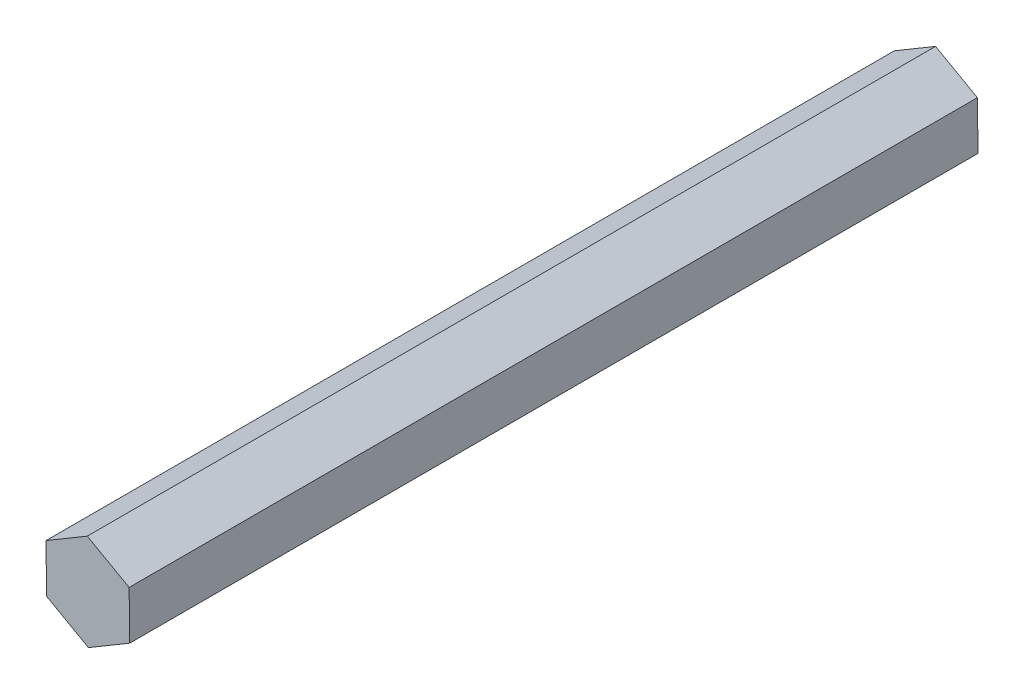
ISO-10303-21;
HEADER;
FILE_DESCRIPTION(('STEP AP214'),'2;1');
FILE_NAME('part.step','',(''),(''),'','','');
FILE_SCHEMA(('AUTOMOTIVE_DESIGN { 1 0 10303 214 1 1 1 1 }'));
ENDSEC;
DATA;
#1=APPLICATION_CONTEXT('core data for automotive mechanical design processes');
#2=APPLICATION_PROTOCOL_DEFINITION('international standard','automotive_design',2000,#1);
#3=PRODUCT_CONTEXT('',#1,'mechanical');
#4=PRODUCT('Part','Part','',(#3));
#5=PRODUCT_RELATED_PRODUCT_CATEGORY('part','',(#4));
#6=PRODUCT_DEFINITION_FORMATION('','',#4);
#7=PRODUCT_DEFINITION_CONTEXT('part definition',#1,'design');
#8=PRODUCT_DEFINITION('design','',#6,#7);
#9=PRODUCT_DEFINITION_SHAPE('','',#8);
#10=(LENGTH_UNIT() NAMED_UNIT(*) SI_UNIT(.MILLI.,.METRE.));
#11=(NAMED_UNIT(*) PLANE_ANGLE_UNIT() SI_UNIT($,.RADIAN.));
#12=(NAMED_UNIT(*) SI_UNIT($,.STERADIAN.) SOLID_ANGLE_UNIT());
#13=UNCERTAINTY_MEASURE_WITH_UNIT(LENGTH_MEASURE(1.E-05),#10,'distance_accuracy_value','');
#14=(GEOMETRIC_REPRESENTATION_CONTEXT(3) GLOBAL_UNCERTAINTY_ASSIGNED_CONTEXT((#13)) GLOBAL_UNIT_ASSIGNED_CONTEXT((#10,
#11,#12)) REPRESENTATION_CONTEXT('',''));
#15=CARTESIAN_POINT('',(0.,0.,0.));
#16=DIRECTION('',(0.,0.,1.));
#17=DIRECTION('',(1.,0.,0.));
#18=AXIS2_PLACEMENT_3D('',#15,#16,#17);
#19=CARTESIAN_POINT('',(1.23330691036255,-0.69266687389056,25.));
#20=DIRECTION('',(-0.999929581507346,-0.0118672670208256,0.));
#21=DIRECTION('',(0.0118672670208256,-0.999929581507346,0.));
#22=AXIS2_PLACEMENT_3D('',#19,#20,#21);
#23=PLANE('',#22);
#24=DIRECTION('',(-0.0118672670208256,0.999929581507346,0.));
#25=VECTOR('',#24,1.);
#26=CARTESIAN_POINT('',(1.23330691036255,-0.69266687389056,0.));
#27=LINE('',#26,#25);
#28=CARTESIAN_POINT('',(1.23330691036255,-0.69266687389056,0.));
#29=VERTEX_POINT('',#28);
#30=CARTESIAN_POINT('',(1.21652056433045,0.721741678091583,0.));
#31=VERTEX_POINT('',#30);
#32=EDGE_CURVE('E128',#29,#31,#27,.T.);
#33=ORIENTED_EDGE('',*,*,#32,.T.);
#34=DIRECTION('',(0.,0.,-1.));
#35=VECTOR('',#34,1.);
#36=CARTESIAN_POINT('',(1.21652056433045,0.721741678091583,25.));
#37=LINE('',#36,#35);
#38=CARTESIAN_POINT('',(1.21652056433045,0.721741678091583,25.));
#39=VERTEX_POINT('',#38);
#40=EDGE_CURVE('E11',#39,#31,#37,.T.);
#41=ORIENTED_EDGE('',*,*,#40,.F.);
#42=DIRECTION('',(-0.0118672670208256,0.999929581507346,0.));
#43=VECTOR('',#42,1.);
#44=CARTESIAN_POINT('',(1.23330691036255,-0.69266687389056,25.));
#45=LINE('',#44,#43);
#46=CARTESIAN_POINT('',(1.23330691036255,-0.69266687389056,25.));
#47=VERTEX_POINT('',#46);
#48=EDGE_CURVE('E144',#47,#39,#45,.T.);
#49=ORIENTED_EDGE('',*,*,#48,.F.);
#50=DIRECTION('',(0.,0.,-1.));
#51=VECTOR('',#50,1.);
#52=CARTESIAN_POINT('',(1.23330691036255,-0.69266687389056,25.));
#53=LINE('',#52,#51);
#54=EDGE_CURVE('E124',#47,#29,#53,.T.);
#55=ORIENTED_EDGE('',*,*,#54,.T.);
#56=EDGE_LOOP('',(#33,#41,#49,#55));
#57=FACE_BOUND('',#56,.T.);
#58=ADVANCED_FACE('F39',(#57),#23,.F.);
#59=CARTESIAN_POINT('',(1.21652056433045,0.721741678091583,25.));
#60=DIRECTION('',(-0.489687436040145,-0.871898053091317,0.));
#61=DIRECTION('',(0.871898053091317,-0.489687436040145,0.));
#62=AXIS2_PLACEMENT_3D('',#59,#60,#61);
#63=PLANE('',#62);
#64=DIRECTION('',(-0.871898053091317,0.489687436040145,0.));
#65=VECTOR('',#64,1.);
#66=CARTESIAN_POINT('',(1.21652056433045,0.721741678091583,0.));
#67=LINE('',#66,#65);
#68=CARTESIAN_POINT('',(-0.0167863460320959,1.41440855198214,0.));
#69=VERTEX_POINT('',#68);
#70=EDGE_CURVE('E132',#31,#69,#67,.T.);
#71=ORIENTED_EDGE('',*,*,#70,.T.);
#72=DIRECTION('',(0.,0.,-1.));
#73=VECTOR('',#72,1.);
#74=CARTESIAN_POINT('',(-0.0167863460320959,1.41440855198214,25.));
#75=LINE('',#74,#73);
#76=CARTESIAN_POINT('',(-0.0167863460320959,1.41440855198214,25.));
#77=VERTEX_POINT('',#76);
#78=EDGE_CURVE('E48',#77,#69,#75,.T.);
#79=ORIENTED_EDGE('',*,*,#78,.F.);
#80=DIRECTION('',(-0.871898053091317,0.489687436040145,0.));
#81=VECTOR('',#80,1.);
#82=CARTESIAN_POINT('',(1.21652056433045,0.721741678091583,25.));
#83=LINE('',#82,#81);
#84=EDGE_CURVE('E93',#39,#77,#83,.T.);
#85=ORIENTED_EDGE('',*,*,#84,.F.);
#86=ORIENTED_EDGE('',*,*,#40,.T.);
#87=EDGE_LOOP('',(#71,#79,#85,#86));
#88=FACE_BOUND('',#87,.T.);
#89=ADVANCED_FACE('F172',(#88),#63,.F.);
#90=CARTESIAN_POINT('',(-0.0167863460320959,1.41440855198214,25.));
#91=DIRECTION('',(0.510242145467202,-0.860030786070491,0.));
#92=DIRECTION('',(0.860030786070491,0.510242145467202,0.));
#93=AXIS2_PLACEMENT_3D('',#90,#91,#92);
#94=PLANE('',#93);
#95=DIRECTION('',(-0.860030786070491,-0.510242145467202,0.));
#96=VECTOR('',#95,1.);
#97=CARTESIAN_POINT('',(-0.0167863460320959,1.41440855198214,0.));
#98=LINE('',#97,#96);
#99=CARTESIAN_POINT('',(-1.23330691036255,0.69266687389056,0.));
#100=VERTEX_POINT('',#99);
#101=EDGE_CURVE('E135',#69,#100,#98,.T.);
#102=ORIENTED_EDGE('',*,*,#101,.T.);
#103=DIRECTION('',(0.,0.,-1.));
#104=VECTOR('',#103,1.);
#105=CARTESIAN_POINT('',(-1.23330691036255,0.69266687389056,25.));
#106=LINE('',#105,#104);
#107=CARTESIAN_POINT('',(-1.23330691036255,0.69266687389056,25.));
#108=VERTEX_POINT('',#107);
#109=EDGE_CURVE('E117',#108,#100,#106,.T.);
#110=ORIENTED_EDGE('',*,*,#109,.F.);
#111=DIRECTION('',(-0.860030786070491,-0.510242145467202,0.));
#112=VECTOR('',#111,1.);
#113=CARTESIAN_POINT('',(-0.0167863460320959,1.41440855198214,25.));
#114=LINE('',#113,#112);
#115=EDGE_CURVE('E106',#77,#108,#114,.T.);
#116=ORIENTED_EDGE('',*,*,#115,.F.);
#117=ORIENTED_EDGE('',*,*,#78,.T.);
#118=EDGE_LOOP('',(#102,#110,#116,#117));
#119=FACE_BOUND('',#118,.T.);
#120=ADVANCED_FACE('F154',(#119),#94,.F.);
#121=CARTESIAN_POINT('',(-1.23330691036255,0.69266687389056,25.));
#122=DIRECTION('',(0.999929581507346,0.0118672670208256,0.));
#123=DIRECTION('',(-0.0118672670208256,0.999929581507346,0.));
#124=AXIS2_PLACEMENT_3D('',#121,#122,#123);
#125=PLANE('',#124);
#126=DIRECTION('',(0.0118672670208256,-0.999929581507346,0.));
#127=VECTOR('',#126,1.);
#128=CARTESIAN_POINT('',(-1.23330691036255,0.69266687389056,0.));
#129=LINE('',#128,#127);
#130=CARTESIAN_POINT('',(-1.21652056433045,-0.721741678091584,0.));
#131=VERTEX_POINT('',#130);
#132=EDGE_CURVE('E115',#100,#131,#129,.T.);
#133=ORIENTED_EDGE('',*,*,#132,.T.);
#134=DIRECTION('',(0.,0.,-1.));
#135=VECTOR('',#134,1.);
#136=CARTESIAN_POINT('',(-1.21652056433045,-0.721741678091584,25.));
#137=LINE('',#136,#135);
#138=CARTESIAN_POINT('',(-1.21652056433045,-0.721741678091584,25.));
#139=VERTEX_POINT('',#138);
#140=EDGE_CURVE('E112',#139,#131,#137,.T.);
#141=ORIENTED_EDGE('',*,*,#140,.F.);
#142=DIRECTION('',(0.0118672670208256,-0.999929581507346,0.));
#143=VECTOR('',#142,1.);
#144=CARTESIAN_POINT('',(-1.23330691036255,0.69266687389056,25.));
#145=LINE('',#144,#143);
#146=EDGE_CURVE('E100',#108,#139,#145,.T.);
#147=ORIENTED_EDGE('',*,*,#146,.F.);
#148=ORIENTED_EDGE('',*,*,#109,.T.);
#149=EDGE_LOOP('',(#133,#141,#147,#148));
#150=FACE_BOUND('',#149,.T.);
#151=ADVANCED_FACE('F113',(#150),#125,.F.);
#152=CARTESIAN_POINT('',(-1.21652056433045,-0.721741678091584,25.));
#153=DIRECTION('',(0.489687436040145,0.871898053091317,0.));
#154=DIRECTION('',(-0.871898053091317,0.489687436040145,0.));
#155=AXIS2_PLACEMENT_3D('',#152,#153,#154);
#156=PLANE('',#155);
#157=DIRECTION('',(0.871898053091317,-0.489687436040145,0.));
#158=VECTOR('',#157,1.);
#159=CARTESIAN_POINT('',(-1.21652056433045,-0.721741678091584,0.));
#160=LINE('',#159,#158);
#161=CARTESIAN_POINT('',(0.0167863460320964,-1.41440855198214,0.));
#162=VERTEX_POINT('',#161);
#163=EDGE_CURVE('E79',#131,#162,#160,.T.);
#164=ORIENTED_EDGE('',*,*,#163,.T.);
#165=DIRECTION('',(0.,0.,-1.));
#166=VECTOR('',#165,1.);
#167=CARTESIAN_POINT('',(0.0167863460320964,-1.41440855198214,25.));
#168=LINE('',#167,#166);
#169=CARTESIAN_POINT('',(0.0167863460320964,-1.41440855198214,25.));
#170=VERTEX_POINT('',#169);
#171=EDGE_CURVE('E118',#170,#162,#168,.T.);
#172=ORIENTED_EDGE('',*,*,#171,.F.);
#173=DIRECTION('',(0.871898053091317,-0.489687436040145,0.));
#174=VECTOR('',#173,1.);
#175=CARTESIAN_POINT('',(-1.21652056433045,-0.721741678091584,25.));
#176=LINE('',#175,#174);
#177=EDGE_CURVE('E104',#139,#170,#176,.T.);
#178=ORIENTED_EDGE('',*,*,#177,.F.);
#179=ORIENTED_EDGE('',*,*,#140,.T.);
#180=EDGE_LOOP('',(#164,#172,#178,#179));
#181=FACE_BOUND('',#180,.T.);
#182=ADVANCED_FACE('F120',(#181),#156,.F.);
#183=CARTESIAN_POINT('',(0.0167863460320964,-1.41440855198214,25.));
#184=DIRECTION('',(-0.510242145467201,0.860030786070491,0.));
#185=DIRECTION('',(-0.860030786070491,-0.510242145467201,0.));
#186=AXIS2_PLACEMENT_3D('',#183,#184,#185);
#187=PLANE('',#186);
#188=DIRECTION('',(0.860030786070491,0.510242145467201,0.));
#189=VECTOR('',#188,1.);
#190=CARTESIAN_POINT('',(0.0167863460320964,-1.41440855198214,0.));
#191=LINE('',#190,#189);
#192=EDGE_CURVE('E85',#162,#29,#191,.T.);
#193=ORIENTED_EDGE('',*,*,#192,.T.);
#194=ORIENTED_EDGE('',*,*,#54,.F.);
#195=DIRECTION('',(0.860030786070491,0.510242145467201,0.));
#196=VECTOR('',#195,1.);
#197=CARTESIAN_POINT('',(0.0167863460320964,-1.41440855198214,25.));
#198=LINE('',#197,#196);
#199=EDGE_CURVE('E56',#170,#47,#198,.T.);
#200=ORIENTED_EDGE('',*,*,#199,.F.);
#201=ORIENTED_EDGE('',*,*,#171,.T.);
#202=EDGE_LOOP('',(#193,#194,#200,#201));
#203=FACE_BOUND('',#202,.T.);
#204=ADVANCED_FACE('F161',(#203),#187,.F.);
#205=CARTESIAN_POINT('',(0.,0.,25.));
#206=DIRECTION('',(0.,0.,1.));
#207=DIRECTION('',(1.,0.,0.));
#208=AXIS2_PLACEMENT_3D('',#205,#206,#207);
#209=PLANE('',#208);
#210=ORIENTED_EDGE('',*,*,#48,.T.);
#211=ORIENTED_EDGE('',*,*,#84,.T.);
#212=ORIENTED_EDGE('',*,*,#115,.T.);
#213=ORIENTED_EDGE('',*,*,#146,.T.);
#214=ORIENTED_EDGE('',*,*,#177,.T.);
#215=ORIENTED_EDGE('',*,*,#199,.T.);
#216=EDGE_LOOP('',(#210,#211,#212,#213,#214,#215));
#217=FACE_BOUND('',#216,.T.);
#218=ADVANCED_FACE('F102',(#217),#209,.T.);
#219=CARTESIAN_POINT('',(0.,0.,0.));
#220=DIRECTION('',(0.,0.,1.));
#221=DIRECTION('',(1.,0.,0.));
#222=AXIS2_PLACEMENT_3D('',#219,#220,#221);
#223=PLANE('',#222);
#224=ORIENTED_EDGE('',*,*,#32,.F.);
#225=ORIENTED_EDGE('',*,*,#192,.F.);
#226=ORIENTED_EDGE('',*,*,#163,.F.);
#227=ORIENTED_EDGE('',*,*,#132,.F.);
#228=ORIENTED_EDGE('',*,*,#101,.F.);
#229=ORIENTED_EDGE('',*,*,#70,.F.);
#230=EDGE_LOOP('',(#224,#225,#226,#227,#228,#229));
#231=FACE_BOUND('',#230,.T.);
#232=ADVANCED_FACE('F157',(#231),#223,.F.);
#233=CLOSED_SHELL('',(#58,#89,#120,#151,#182,#204,#218,#232));
#234=MANIFOLD_SOLID_BREP('B2',#233);
#235=ADVANCED_BREP_SHAPE_REPRESENTATION('',(#18,#234),#14);
#236=SHAPE_DEFINITION_REPRESENTATION(#9,#235);
ENDSEC;
END-ISO-10303-21;
